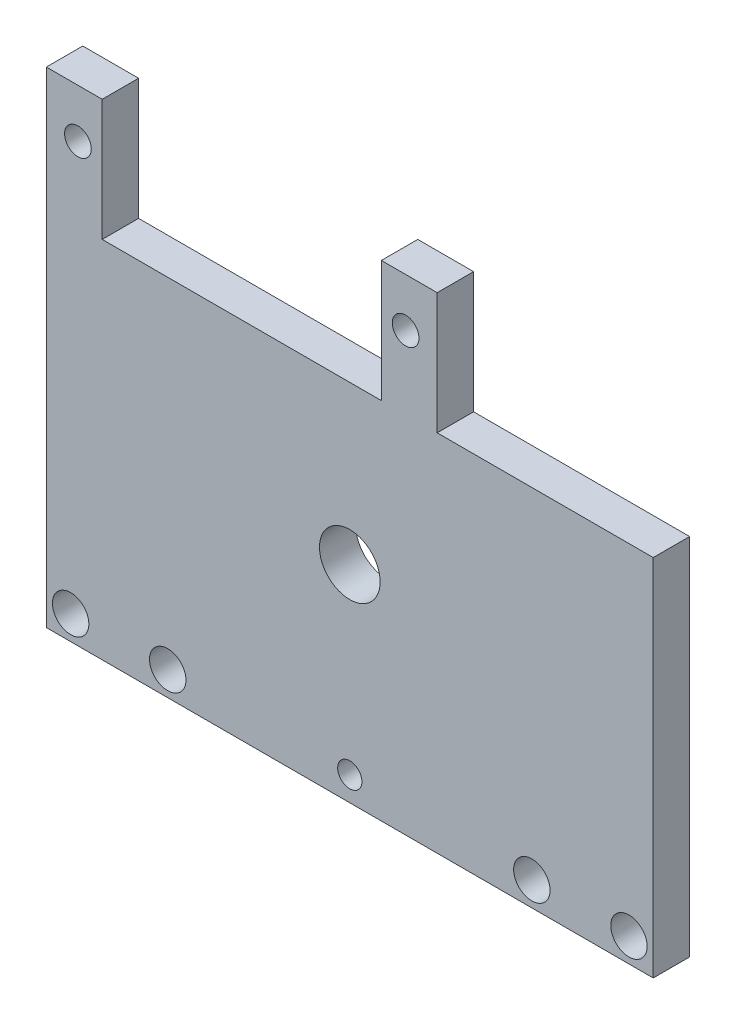
ISO-10303-21;
HEADER;
FILE_DESCRIPTION(('STEP AP214'),'2;1');
FILE_NAME('part.step','',(''),(''),'','','');
FILE_SCHEMA(('AUTOMOTIVE_DESIGN { 1 0 10303 214 1 1 1 1 }'));
ENDSEC;
DATA;
#1=APPLICATION_CONTEXT('core data for automotive mechanical design processes');
#2=APPLICATION_PROTOCOL_DEFINITION('international standard','automotive_design',2000,#1);
#3=PRODUCT_CONTEXT('',#1,'mechanical');
#4=PRODUCT('Part','Part','',(#3));
#5=PRODUCT_RELATED_PRODUCT_CATEGORY('part','',(#4));
#6=PRODUCT_DEFINITION_FORMATION('','',#4);
#7=PRODUCT_DEFINITION_CONTEXT('part definition',#1,'design');
#8=PRODUCT_DEFINITION('design','',#6,#7);
#9=PRODUCT_DEFINITION_SHAPE('','',#8);
#10=(LENGTH_UNIT() NAMED_UNIT(*) SI_UNIT(.MILLI.,.METRE.));
#11=(NAMED_UNIT(*) PLANE_ANGLE_UNIT() SI_UNIT($,.RADIAN.));
#12=(NAMED_UNIT(*) SI_UNIT($,.STERADIAN.) SOLID_ANGLE_UNIT());
#13=UNCERTAINTY_MEASURE_WITH_UNIT(LENGTH_MEASURE(1.E-05),#10,'distance_accuracy_value','');
#14=(GEOMETRIC_REPRESENTATION_CONTEXT(3) GLOBAL_UNCERTAINTY_ASSIGNED_CONTEXT((#13)) GLOBAL_UNIT_ASSIGNED_CONTEXT((#10,
#11,#12)) REPRESENTATION_CONTEXT('',''));
#15=CARTESIAN_POINT('',(0.,0.,0.));
#16=DIRECTION('',(0.,0.,1.));
#17=DIRECTION('',(1.,0.,0.));
#18=AXIS2_PLACEMENT_3D('',#15,#16,#17);
#19=CARTESIAN_POINT('',(0.,0.,3.));
#20=DIRECTION('',(0.,0.,1.));
#21=DIRECTION('',(1.,0.,0.));
#22=AXIS2_PLACEMENT_3D('',#19,#20,#21);
#23=PLANE('',#22);
#24=CARTESIAN_POINT('',(-27.410287043584,-20.6486779763174,3.));
#25=DIRECTION('',(0.,0.,1.));
#26=DIRECTION('',(1.,0.,0.));
#27=AXIS2_PLACEMENT_3D('',#24,#25,#26);
#28=CIRCLE('',#27,1.5);
#29=CARTESIAN_POINT('',(-25.910287043584,-20.6486779763174,3.));
#30=VERTEX_POINT('',#29);
#31=EDGE_CURVE('E242',#30,#30,#28,.T.);
#32=ORIENTED_EDGE('',*,*,#31,.F.);
#33=EDGE_LOOP('',(#32));
#34=FACE_BOUND('',#33,.T.);
#35=CARTESIAN_POINT('',(10.589712956416,-20.6486779763174,3.));
#36=DIRECTION('',(0.,0.,1.));
#37=DIRECTION('',(1.,0.,0.));
#38=AXIS2_PLACEMENT_3D('',#35,#36,#37);
#39=CIRCLE('',#38,1.5);
#40=CARTESIAN_POINT('',(12.089712956416,-20.6486779763174,3.));
#41=VERTEX_POINT('',#40);
#42=EDGE_CURVE('E230',#41,#41,#39,.T.);
#43=ORIENTED_EDGE('',*,*,#42,.F.);
#44=EDGE_LOOP('',(#43));
#45=FACE_BOUND('',#44,.T.);
#46=CARTESIAN_POINT('',(-7.81028704358401,13.3513220236826,3.));
#47=DIRECTION('',(0.,0.,1.));
#48=DIRECTION('',(1.,0.,0.));
#49=AXIS2_PLACEMENT_3D('',#46,#47,#48);
#50=CIRCLE('',#49,1.1);
#51=CARTESIAN_POINT('',(-6.710287043584,13.3513220236826,3.));
#52=VERTEX_POINT('',#51);
#53=EDGE_CURVE('E218',#52,#52,#50,.T.);
#54=ORIENTED_EDGE('',*,*,#53,.F.);
#55=EDGE_LOOP('',(#54));
#56=FACE_BOUND('',#55,.T.);
#57=CARTESIAN_POINT('',(-12.410287043584,-5.64867797631744,3.));
#58=DIRECTION('',(0.,0.,1.));
#59=DIRECTION('',(1.,0.,0.));
#60=AXIS2_PLACEMENT_3D('',#57,#58,#59);
#61=CIRCLE('',#60,2.5);
#62=CARTESIAN_POINT('',(-9.910287043584,-5.64867797631744,3.));
#63=VERTEX_POINT('',#62);
#64=EDGE_CURVE('E145',#63,#63,#61,.T.);
#65=ORIENTED_EDGE('',*,*,#64,.F.);
#66=EDGE_LOOP('',(#65));
#67=FACE_BOUND('',#66,.T.);
#68=DIRECTION('',(-1.,0.,0.));
#69=VECTOR('',#68,1.);
#70=CARTESIAN_POINT('',(-5.210287043584,7.35132202368256,3.));
#71=LINE('',#70,#69);
#72=CARTESIAN_POINT('',(12.589712956416,7.35132202368256,3.));
#73=VERTEX_POINT('',#72);
#74=CARTESIAN_POINT('',(-5.210287043584,7.35132202368256,3.));
#75=VERTEX_POINT('',#74);
#76=EDGE_CURVE('E161',#73,#75,#71,.T.);
#77=ORIENTED_EDGE('',*,*,#76,.T.);
#78=DIRECTION('',(0.,1.,0.));
#79=VECTOR('',#78,1.);
#80=CARTESIAN_POINT('',(-5.210287043584,7.35132202368256,3.));
#81=LINE('',#80,#79);
#82=CARTESIAN_POINT('',(-5.210287043584,17.3513220236826,3.));
#83=VERTEX_POINT('',#82);
#84=EDGE_CURVE('E99',#75,#83,#81,.T.);
#85=ORIENTED_EDGE('',*,*,#84,.T.);
#86=DIRECTION('',(-1.,0.,0.));
#87=VECTOR('',#86,1.);
#88=CARTESIAN_POINT('',(-9.810287043584,17.3513220236826,3.));
#89=LINE('',#88,#87);
#90=CARTESIAN_POINT('',(-9.810287043584,17.3513220236826,3.));
#91=VERTEX_POINT('',#90);
#92=EDGE_CURVE('E182',#83,#91,#89,.T.);
#93=ORIENTED_EDGE('',*,*,#92,.T.);
#94=DIRECTION('',(0.,-1.,0.));
#95=VECTOR('',#94,1.);
#96=CARTESIAN_POINT('',(-9.810287043584,7.35132202368256,3.));
#97=LINE('',#96,#95);
#98=CARTESIAN_POINT('',(-9.810287043584,7.35132202368256,3.));
#99=VERTEX_POINT('',#98);
#100=EDGE_CURVE('E201',#91,#99,#97,.T.);
#101=ORIENTED_EDGE('',*,*,#100,.T.);
#102=DIRECTION('',(-1.,0.,0.));
#103=VECTOR('',#102,1.);
#104=CARTESIAN_POINT('',(-32.810287043584,7.35132202368256,3.));
#105=LINE('',#104,#103);
#106=CARTESIAN_POINT('',(-32.810287043584,7.35132202368256,3.));
#107=VERTEX_POINT('',#106);
#108=EDGE_CURVE('E198',#99,#107,#105,.T.);
#109=ORIENTED_EDGE('',*,*,#108,.T.);
#110=DIRECTION('',(0.,1.,0.));
#111=VECTOR('',#110,1.);
#112=CARTESIAN_POINT('',(-32.810287043584,7.35132202368256,3.));
#113=LINE('',#112,#111);
#114=CARTESIAN_POINT('',(-32.810287043584,17.3513220236826,3.));
#115=VERTEX_POINT('',#114);
#116=EDGE_CURVE('E200',#107,#115,#113,.T.);
#117=ORIENTED_EDGE('',*,*,#116,.T.);
#118=DIRECTION('',(-1.,0.,0.));
#119=VECTOR('',#118,1.);
#120=CARTESIAN_POINT('',(-37.410287043584,17.3513220236826,3.));
#121=LINE('',#120,#119);
#122=CARTESIAN_POINT('',(-37.410287043584,17.3513220236826,3.));
#123=VERTEX_POINT('',#122);
#124=EDGE_CURVE('E124',#115,#123,#121,.T.);
#125=ORIENTED_EDGE('',*,*,#124,.T.);
#126=DIRECTION('',(0.,-1.,0.));
#127=VECTOR('',#126,1.);
#128=CARTESIAN_POINT('',(-37.410287043584,7.35132202368256,3.));
#129=LINE('',#128,#127);
#130=CARTESIAN_POINT('',(-37.410287043584,-22.6486779763174,3.));
#131=VERTEX_POINT('',#130);
#132=EDGE_CURVE('E118',#123,#131,#129,.T.);
#133=ORIENTED_EDGE('',*,*,#132,.T.);
#134=DIRECTION('',(1.,0.,0.));
#135=VECTOR('',#134,1.);
#136=CARTESIAN_POINT('',(-37.410287043584,-22.6486779763174,3.));
#137=LINE('',#136,#135);
#138=CARTESIAN_POINT('',(12.589712956416,-22.6486779763174,3.));
#139=VERTEX_POINT('',#138);
#140=EDGE_CURVE('E122',#131,#139,#137,.T.);
#141=ORIENTED_EDGE('',*,*,#140,.T.);
#142=DIRECTION('',(0.,1.,0.));
#143=VECTOR('',#142,1.);
#144=CARTESIAN_POINT('',(12.589712956416,-22.6486779763174,3.));
#145=LINE('',#144,#143);
#146=EDGE_CURVE('E50',#139,#73,#145,.T.);
#147=ORIENTED_EDGE('',*,*,#146,.T.);
#148=EDGE_LOOP('',(#77,#85,#93,#101,#109,#117,#125,#133,#141,#147));
#149=FACE_BOUND('',#148,.T.);
#150=CARTESIAN_POINT('',(-34.810287043584,13.3513220236826,3.));
#151=DIRECTION('',(0.,0.,1.));
#152=DIRECTION('',(1.,0.,0.));
#153=AXIS2_PLACEMENT_3D('',#150,#151,#152);
#154=CIRCLE('',#153,1.1);
#155=CARTESIAN_POINT('',(-33.710287043584,13.3513220236826,3.));
#156=VERTEX_POINT('',#155);
#157=EDGE_CURVE('E212',#156,#156,#154,.T.);
#158=ORIENTED_EDGE('',*,*,#157,.F.);
#159=EDGE_LOOP('',(#158));
#160=FACE_BOUND('',#159,.T.);
#161=CARTESIAN_POINT('',(-35.410287043584,-20.6486779763174,3.));
#162=DIRECTION('',(0.,0.,1.));
#163=DIRECTION('',(1.,0.,0.));
#164=AXIS2_PLACEMENT_3D('',#161,#162,#163);
#165=CIRCLE('',#164,1.5);
#166=CARTESIAN_POINT('',(-33.910287043584,-20.6486779763174,3.));
#167=VERTEX_POINT('',#166);
#168=EDGE_CURVE('E224',#167,#167,#165,.T.);
#169=ORIENTED_EDGE('',*,*,#168,.F.);
#170=EDGE_LOOP('',(#169));
#171=FACE_BOUND('',#170,.T.);
#172=CARTESIAN_POINT('',(-12.410287043584,-20.6486779763174,3.));
#173=DIRECTION('',(0.,0.,1.));
#174=DIRECTION('',(1.,0.,0.));
#175=AXIS2_PLACEMENT_3D('',#172,#173,#174);
#176=CIRCLE('',#175,1.);
#177=CARTESIAN_POINT('',(-11.410287043584,-20.6486779763174,3.));
#178=VERTEX_POINT('',#177);
#179=EDGE_CURVE('E236',#178,#178,#176,.T.);
#180=ORIENTED_EDGE('',*,*,#179,.F.);
#181=EDGE_LOOP('',(#180));
#182=FACE_BOUND('',#181,.T.);
#183=CARTESIAN_POINT('',(2.589712956416,-20.6486779763174,3.));
#184=DIRECTION('',(0.,0.,1.));
#185=DIRECTION('',(1.,0.,0.));
#186=AXIS2_PLACEMENT_3D('',#183,#184,#185);
#187=CIRCLE('',#186,1.5);
#188=CARTESIAN_POINT('',(4.089712956416,-20.6486779763174,3.));
#189=VERTEX_POINT('',#188);
#190=EDGE_CURVE('E248',#189,#189,#187,.T.);
#191=ORIENTED_EDGE('',*,*,#190,.F.);
#192=EDGE_LOOP('',(#191));
#193=FACE_BOUND('',#192,.T.);
#194=ADVANCED_FACE('F33',(#34,#45,#56,#67,#149,#160,#171,#182,#193),#23,.T.);
#195=CARTESIAN_POINT('',(0.,0.,0.));
#196=DIRECTION('',(0.,0.,1.));
#197=DIRECTION('',(1.,0.,0.));
#198=AXIS2_PLACEMENT_3D('',#195,#196,#197);
#199=PLANE('',#198);
#200=DIRECTION('',(-1.,0.,0.));
#201=VECTOR('',#200,1.);
#202=CARTESIAN_POINT('',(-5.210287043584,7.35132202368256,0.));
#203=LINE('',#202,#201);
#204=CARTESIAN_POINT('',(12.589712956416,7.35132202368256,0.));
#205=VERTEX_POINT('',#204);
#206=CARTESIAN_POINT('',(-5.210287043584,7.35132202368256,0.));
#207=VERTEX_POINT('',#206);
#208=EDGE_CURVE('E141',#205,#207,#203,.T.);
#209=ORIENTED_EDGE('',*,*,#208,.F.);
#210=DIRECTION('',(0.,1.,0.));
#211=VECTOR('',#210,1.);
#212=CARTESIAN_POINT('',(12.589712956416,-22.6486779763174,0.));
#213=LINE('',#212,#211);
#214=CARTESIAN_POINT('',(12.589712956416,-22.6486779763174,0.));
#215=VERTEX_POINT('',#214);
#216=EDGE_CURVE('E91',#215,#205,#213,.T.);
#217=ORIENTED_EDGE('',*,*,#216,.F.);
#218=DIRECTION('',(1.,0.,0.));
#219=VECTOR('',#218,1.);
#220=CARTESIAN_POINT('',(-37.410287043584,-22.6486779763174,0.));
#221=LINE('',#220,#219);
#222=CARTESIAN_POINT('',(-37.410287043584,-22.6486779763174,0.));
#223=VERTEX_POINT('',#222);
#224=EDGE_CURVE('E85',#223,#215,#221,.T.);
#225=ORIENTED_EDGE('',*,*,#224,.F.);
#226=DIRECTION('',(0.,-1.,0.));
#227=VECTOR('',#226,1.);
#228=CARTESIAN_POINT('',(-37.410287043584,-22.6486779763174,0.));
#229=LINE('',#228,#227);
#230=CARTESIAN_POINT('',(-37.410287043584,17.3513220236826,0.));
#231=VERTEX_POINT('',#230);
#232=EDGE_CURVE('E131',#231,#223,#229,.T.);
#233=ORIENTED_EDGE('',*,*,#232,.F.);
#234=DIRECTION('',(-1.,0.,0.));
#235=VECTOR('',#234,1.);
#236=CARTESIAN_POINT('',(-37.410287043584,17.3513220236826,0.));
#237=LINE('',#236,#235);
#238=CARTESIAN_POINT('',(-32.810287043584,17.3513220236826,0.));
#239=VERTEX_POINT('',#238);
#240=EDGE_CURVE('E155',#239,#231,#237,.T.);
#241=ORIENTED_EDGE('',*,*,#240,.F.);
#242=DIRECTION('',(0.,1.,0.));
#243=VECTOR('',#242,1.);
#244=CARTESIAN_POINT('',(-32.810287043584,7.35132202368256,0.));
#245=LINE('',#244,#243);
#246=CARTESIAN_POINT('',(-32.810287043584,7.35132202368256,0.));
#247=VERTEX_POINT('',#246);
#248=EDGE_CURVE('E153',#247,#239,#245,.T.);
#249=ORIENTED_EDGE('',*,*,#248,.F.);
#250=DIRECTION('',(-1.,0.,0.));
#251=VECTOR('',#250,1.);
#252=CARTESIAN_POINT('',(-32.810287043584,7.35132202368256,0.));
#253=LINE('',#252,#251);
#254=CARTESIAN_POINT('',(-9.810287043584,7.35132202368256,0.));
#255=VERTEX_POINT('',#254);
#256=EDGE_CURVE('E151',#255,#247,#253,.T.);
#257=ORIENTED_EDGE('',*,*,#256,.F.);
#258=DIRECTION('',(0.,-1.,0.));
#259=VECTOR('',#258,1.);
#260=CARTESIAN_POINT('',(-9.810287043584,7.35132202368256,0.));
#261=LINE('',#260,#259);
#262=CARTESIAN_POINT('',(-9.810287043584,17.3513220236826,0.));
#263=VERTEX_POINT('',#262);
#264=EDGE_CURVE('E149',#263,#255,#261,.T.);
#265=ORIENTED_EDGE('',*,*,#264,.F.);
#266=DIRECTION('',(-1.,0.,0.));
#267=VECTOR('',#266,1.);
#268=CARTESIAN_POINT('',(-9.810287043584,17.3513220236826,0.));
#269=LINE('',#268,#267);
#270=CARTESIAN_POINT('',(-5.210287043584,17.3513220236826,0.));
#271=VERTEX_POINT('',#270);
#272=EDGE_CURVE('E147',#271,#263,#269,.T.);
#273=ORIENTED_EDGE('',*,*,#272,.F.);
#274=DIRECTION('',(0.,1.,0.));
#275=VECTOR('',#274,1.);
#276=CARTESIAN_POINT('',(-5.210287043584,7.35132202368256,0.));
#277=LINE('',#276,#275);
#278=EDGE_CURVE('E144',#207,#271,#277,.T.);
#279=ORIENTED_EDGE('',*,*,#278,.F.);
#280=EDGE_LOOP('',(#209,#217,#225,#233,#241,#249,#257,#265,#273,#279));
#281=FACE_BOUND('',#280,.T.);
#282=CARTESIAN_POINT('',(-12.410287043584,-5.64867797631744,0.));
#283=DIRECTION('',(0.,0.,1.));
#284=DIRECTION('',(1.,0.,0.));
#285=AXIS2_PLACEMENT_3D('',#282,#283,#284);
#286=CIRCLE('',#285,2.5);
#287=CARTESIAN_POINT('',(-9.910287043584,-5.64867797631744,0.));
#288=VERTEX_POINT('',#287);
#289=EDGE_CURVE('E209',#288,#288,#286,.T.);
#290=ORIENTED_EDGE('',*,*,#289,.T.);
#291=EDGE_LOOP('',(#290));
#292=FACE_BOUND('',#291,.T.);
#293=CARTESIAN_POINT('',(-34.810287043584,13.3513220236826,0.));
#294=DIRECTION('',(0.,0.,1.));
#295=DIRECTION('',(1.,0.,0.));
#296=AXIS2_PLACEMENT_3D('',#293,#294,#295);
#297=CIRCLE('',#296,1.1);
#298=CARTESIAN_POINT('',(-33.710287043584,13.3513220236826,0.));
#299=VERTEX_POINT('',#298);
#300=EDGE_CURVE('E215',#299,#299,#297,.T.);
#301=ORIENTED_EDGE('',*,*,#300,.T.);
#302=EDGE_LOOP('',(#301));
#303=FACE_BOUND('',#302,.T.);
#304=CARTESIAN_POINT('',(-7.81028704358401,13.3513220236826,0.));
#305=DIRECTION('',(0.,0.,1.));
#306=DIRECTION('',(1.,0.,0.));
#307=AXIS2_PLACEMENT_3D('',#304,#305,#306);
#308=CIRCLE('',#307,1.1);
#309=CARTESIAN_POINT('',(-6.710287043584,13.3513220236826,0.));
#310=VERTEX_POINT('',#309);
#311=EDGE_CURVE('E221',#310,#310,#308,.T.);
#312=ORIENTED_EDGE('',*,*,#311,.T.);
#313=EDGE_LOOP('',(#312));
#314=FACE_BOUND('',#313,.T.);
#315=CARTESIAN_POINT('',(-35.410287043584,-20.6486779763174,0.));
#316=DIRECTION('',(0.,0.,1.));
#317=DIRECTION('',(1.,0.,0.));
#318=AXIS2_PLACEMENT_3D('',#315,#316,#317);
#319=CIRCLE('',#318,1.5);
#320=CARTESIAN_POINT('',(-33.910287043584,-20.6486779763174,0.));
#321=VERTEX_POINT('',#320);
#322=EDGE_CURVE('E227',#321,#321,#319,.T.);
#323=ORIENTED_EDGE('',*,*,#322,.T.);
#324=EDGE_LOOP('',(#323));
#325=FACE_BOUND('',#324,.T.);
#326=CARTESIAN_POINT('',(10.589712956416,-20.6486779763174,0.));
#327=DIRECTION('',(0.,0.,1.));
#328=DIRECTION('',(1.,0.,0.));
#329=AXIS2_PLACEMENT_3D('',#326,#327,#328);
#330=CIRCLE('',#329,1.5);
#331=CARTESIAN_POINT('',(12.089712956416,-20.6486779763174,0.));
#332=VERTEX_POINT('',#331);
#333=EDGE_CURVE('E233',#332,#332,#330,.T.);
#334=ORIENTED_EDGE('',*,*,#333,.T.);
#335=EDGE_LOOP('',(#334));
#336=FACE_BOUND('',#335,.T.);
#337=CARTESIAN_POINT('',(-12.410287043584,-20.6486779763174,0.));
#338=DIRECTION('',(0.,0.,1.));
#339=DIRECTION('',(1.,0.,0.));
#340=AXIS2_PLACEMENT_3D('',#337,#338,#339);
#341=CIRCLE('',#340,1.);
#342=CARTESIAN_POINT('',(-11.410287043584,-20.6486779763174,0.));
#343=VERTEX_POINT('',#342);
#344=EDGE_CURVE('E239',#343,#343,#341,.T.);
#345=ORIENTED_EDGE('',*,*,#344,.T.);
#346=EDGE_LOOP('',(#345));
#347=FACE_BOUND('',#346,.T.);
#348=CARTESIAN_POINT('',(-27.410287043584,-20.6486779763174,0.));
#349=DIRECTION('',(0.,0.,1.));
#350=DIRECTION('',(1.,0.,0.));
#351=AXIS2_PLACEMENT_3D('',#348,#349,#350);
#352=CIRCLE('',#351,1.5);
#353=CARTESIAN_POINT('',(-25.910287043584,-20.6486779763174,0.));
#354=VERTEX_POINT('',#353);
#355=EDGE_CURVE('E245',#354,#354,#352,.T.);
#356=ORIENTED_EDGE('',*,*,#355,.T.);
#357=EDGE_LOOP('',(#356));
#358=FACE_BOUND('',#357,.T.);
#359=CARTESIAN_POINT('',(2.589712956416,-20.6486779763174,0.));
#360=DIRECTION('',(0.,0.,1.));
#361=DIRECTION('',(1.,0.,0.));
#362=AXIS2_PLACEMENT_3D('',#359,#360,#361);
#363=CIRCLE('',#362,1.5);
#364=CARTESIAN_POINT('',(4.089712956416,-20.6486779763174,0.));
#365=VERTEX_POINT('',#364);
#366=EDGE_CURVE('E251',#365,#365,#363,.T.);
#367=ORIENTED_EDGE('',*,*,#366,.T.);
#368=EDGE_LOOP('',(#367));
#369=FACE_BOUND('',#368,.T.);
#370=ADVANCED_FACE('F186',(#281,#292,#303,#314,#325,#336,#347,#358,#369),#199,.F.);
#371=CARTESIAN_POINT('',(-5.210287043584,7.35132202368256,3.));
#372=DIRECTION('',(0.,-1.,0.));
#373=DIRECTION('',(0.,0.,-1.));
#374=AXIS2_PLACEMENT_3D('',#371,#372,#373);
#375=PLANE('',#374);
#376=ORIENTED_EDGE('',*,*,#208,.T.);
#377=DIRECTION('',(0.,0.,-1.));
#378=VECTOR('',#377,1.);
#379=CARTESIAN_POINT('',(-5.210287043584,7.35132202368256,3.));
#380=LINE('',#379,#378);
#381=EDGE_CURVE('E11',#75,#207,#380,.T.);
#382=ORIENTED_EDGE('',*,*,#381,.F.);
#383=ORIENTED_EDGE('',*,*,#76,.F.);
#384=DIRECTION('',(0.,0.,-1.));
#385=VECTOR('',#384,1.);
#386=CARTESIAN_POINT('',(12.589712956416,7.35132202368256,3.));
#387=LINE('',#386,#385);
#388=EDGE_CURVE('E137',#73,#205,#387,.T.);
#389=ORIENTED_EDGE('',*,*,#388,.T.);
#390=EDGE_LOOP('',(#376,#382,#383,#389));
#391=FACE_BOUND('',#390,.T.);
#392=ADVANCED_FACE('F35',(#391),#375,.F.);
#393=CARTESIAN_POINT('',(-5.210287043584,7.35132202368256,3.));
#394=DIRECTION('',(-1.,0.,0.));
#395=DIRECTION('',(0.,0.,1.));
#396=AXIS2_PLACEMENT_3D('',#393,#394,#395);
#397=PLANE('',#396);
#398=ORIENTED_EDGE('',*,*,#278,.T.);
#399=DIRECTION('',(0.,0.,-1.));
#400=VECTOR('',#399,1.);
#401=CARTESIAN_POINT('',(-5.210287043584,17.3513220236826,3.));
#402=LINE('',#401,#400);
#403=EDGE_CURVE('E42',#83,#271,#402,.T.);
#404=ORIENTED_EDGE('',*,*,#403,.F.);
#405=ORIENTED_EDGE('',*,*,#84,.F.);
#406=ORIENTED_EDGE('',*,*,#381,.T.);
#407=EDGE_LOOP('',(#398,#404,#405,#406));
#408=FACE_BOUND('',#407,.T.);
#409=ADVANCED_FACE('F293',(#408),#397,.F.);
#410=CARTESIAN_POINT('',(-9.810287043584,17.3513220236826,3.));
#411=DIRECTION('',(0.,-1.,0.));
#412=DIRECTION('',(0.,0.,-1.));
#413=AXIS2_PLACEMENT_3D('',#410,#411,#412);
#414=PLANE('',#413);
#415=ORIENTED_EDGE('',*,*,#272,.T.);
#416=DIRECTION('',(0.,0.,-1.));
#417=VECTOR('',#416,1.);
#418=CARTESIAN_POINT('',(-9.810287043584,17.3513220236826,3.));
#419=LINE('',#418,#417);
#420=EDGE_CURVE('E174',#91,#263,#419,.T.);
#421=ORIENTED_EDGE('',*,*,#420,.F.);
#422=ORIENTED_EDGE('',*,*,#92,.F.);
#423=ORIENTED_EDGE('',*,*,#403,.T.);
#424=EDGE_LOOP('',(#415,#421,#422,#423));
#425=FACE_BOUND('',#424,.T.);
#426=ADVANCED_FACE('F180',(#425),#414,.F.);
#427=CARTESIAN_POINT('',(-9.810287043584,7.35132202368256,3.));
#428=DIRECTION('',(1.,0.,0.));
#429=DIRECTION('',(0.,0.,-1.));
#430=AXIS2_PLACEMENT_3D('',#427,#428,#429);
#431=PLANE('',#430);
#432=ORIENTED_EDGE('',*,*,#264,.T.);
#433=DIRECTION('',(0.,0.,-1.));
#434=VECTOR('',#433,1.);
#435=CARTESIAN_POINT('',(-9.810287043584,7.35132202368256,3.));
#436=LINE('',#435,#434);
#437=EDGE_CURVE('E171',#99,#255,#436,.T.);
#438=ORIENTED_EDGE('',*,*,#437,.F.);
#439=ORIENTED_EDGE('',*,*,#100,.F.);
#440=ORIENTED_EDGE('',*,*,#420,.T.);
#441=EDGE_LOOP('',(#432,#438,#439,#440));
#442=FACE_BOUND('',#441,.T.);
#443=ADVANCED_FACE('F192',(#442),#431,.F.);
#444=CARTESIAN_POINT('',(-32.810287043584,7.35132202368256,3.));
#445=DIRECTION('',(0.,-1.,0.));
#446=DIRECTION('',(0.,0.,-1.));
#447=AXIS2_PLACEMENT_3D('',#444,#445,#446);
#448=PLANE('',#447);
#449=ORIENTED_EDGE('',*,*,#256,.T.);
#450=DIRECTION('',(0.,0.,-1.));
#451=VECTOR('',#450,1.);
#452=CARTESIAN_POINT('',(-32.810287043584,7.35132202368256,3.));
#453=LINE('',#452,#451);
#454=EDGE_CURVE('E168',#107,#247,#453,.T.);
#455=ORIENTED_EDGE('',*,*,#454,.F.);
#456=ORIENTED_EDGE('',*,*,#108,.F.);
#457=ORIENTED_EDGE('',*,*,#437,.T.);
#458=EDGE_LOOP('',(#449,#455,#456,#457));
#459=FACE_BOUND('',#458,.T.);
#460=ADVANCED_FACE('F196',(#459),#448,.F.);
#461=CARTESIAN_POINT('',(-32.810287043584,7.35132202368256,3.));
#462=DIRECTION('',(-1.,0.,0.));
#463=DIRECTION('',(0.,0.,1.));
#464=AXIS2_PLACEMENT_3D('',#461,#462,#463);
#465=PLANE('',#464);
#466=ORIENTED_EDGE('',*,*,#248,.T.);
#467=DIRECTION('',(0.,0.,-1.));
#468=VECTOR('',#467,1.);
#469=CARTESIAN_POINT('',(-32.810287043584,17.3513220236826,3.));
#470=LINE('',#469,#468);
#471=EDGE_CURVE('E165',#115,#239,#470,.T.);
#472=ORIENTED_EDGE('',*,*,#471,.F.);
#473=ORIENTED_EDGE('',*,*,#116,.F.);
#474=ORIENTED_EDGE('',*,*,#454,.T.);
#475=EDGE_LOOP('',(#466,#472,#473,#474));
#476=FACE_BOUND('',#475,.T.);
#477=ADVANCED_FACE('F283',(#476),#465,.F.);
#478=CARTESIAN_POINT('',(-37.410287043584,17.3513220236826,3.));
#479=DIRECTION('',(0.,-1.,0.));
#480=DIRECTION('',(0.,0.,-1.));
#481=AXIS2_PLACEMENT_3D('',#478,#479,#480);
#482=PLANE('',#481);
#483=ORIENTED_EDGE('',*,*,#240,.T.);
#484=DIRECTION('',(0.,0.,-1.));
#485=VECTOR('',#484,1.);
#486=CARTESIAN_POINT('',(-37.410287043584,17.3513220236826,3.));
#487=LINE('',#486,#485);
#488=EDGE_CURVE('E132',#123,#231,#487,.T.);
#489=ORIENTED_EDGE('',*,*,#488,.F.);
#490=ORIENTED_EDGE('',*,*,#124,.F.);
#491=ORIENTED_EDGE('',*,*,#471,.T.);
#492=EDGE_LOOP('',(#483,#489,#490,#491));
#493=FACE_BOUND('',#492,.T.);
#494=ADVANCED_FACE('F280',(#493),#482,.F.);
#495=CARTESIAN_POINT('',(-37.410287043584,-22.6486779763174,3.));
#496=DIRECTION('',(1.,0.,0.));
#497=DIRECTION('',(0.,0.,-1.));
#498=AXIS2_PLACEMENT_3D('',#495,#496,#497);
#499=PLANE('',#498);
#500=ORIENTED_EDGE('',*,*,#232,.T.);
#501=DIRECTION('',(0.,0.,-1.));
#502=VECTOR('',#501,1.);
#503=CARTESIAN_POINT('',(-37.410287043584,-22.6486779763174,3.));
#504=LINE('',#503,#502);
#505=EDGE_CURVE('E129',#131,#223,#504,.T.);
#506=ORIENTED_EDGE('',*,*,#505,.F.);
#507=ORIENTED_EDGE('',*,*,#132,.F.);
#508=ORIENTED_EDGE('',*,*,#488,.T.);
#509=EDGE_LOOP('',(#500,#506,#507,#508));
#510=FACE_BOUND('',#509,.T.);
#511=ADVANCED_FACE('F130',(#510),#499,.F.);
#512=CARTESIAN_POINT('',(-37.410287043584,-22.6486779763174,3.));
#513=DIRECTION('',(0.,1.,0.));
#514=DIRECTION('',(0.,0.,1.));
#515=AXIS2_PLACEMENT_3D('',#512,#513,#514);
#516=PLANE('',#515);
#517=ORIENTED_EDGE('',*,*,#224,.T.);
#518=DIRECTION('',(0.,0.,-1.));
#519=VECTOR('',#518,1.);
#520=CARTESIAN_POINT('',(12.589712956416,-22.6486779763174,3.));
#521=LINE('',#520,#519);
#522=EDGE_CURVE('E133',#139,#215,#521,.T.);
#523=ORIENTED_EDGE('',*,*,#522,.F.);
#524=ORIENTED_EDGE('',*,*,#140,.F.);
#525=ORIENTED_EDGE('',*,*,#505,.T.);
#526=EDGE_LOOP('',(#517,#523,#524,#525));
#527=FACE_BOUND('',#526,.T.);
#528=ADVANCED_FACE('F135',(#527),#516,.F.);
#529=CARTESIAN_POINT('',(12.589712956416,-22.6486779763174,3.));
#530=DIRECTION('',(-1.,0.,0.));
#531=DIRECTION('',(0.,0.,1.));
#532=AXIS2_PLACEMENT_3D('',#529,#530,#531);
#533=PLANE('',#532);
#534=ORIENTED_EDGE('',*,*,#216,.T.);
#535=ORIENTED_EDGE('',*,*,#388,.F.);
#536=ORIENTED_EDGE('',*,*,#146,.F.);
#537=ORIENTED_EDGE('',*,*,#522,.T.);
#538=EDGE_LOOP('',(#534,#535,#536,#537));
#539=FACE_BOUND('',#538,.T.);
#540=ADVANCED_FACE('F273',(#539),#533,.F.);
#541=CARTESIAN_POINT('',(-12.410287043584,-5.64867797631744,3.));
#542=DIRECTION('',(0.,0.,-1.));
#543=DIRECTION('',(-1.,0.,0.));
#544=AXIS2_PLACEMENT_3D('',#541,#542,#543);
#545=CYLINDRICAL_SURFACE('',#544,2.5);
#546=ORIENTED_EDGE('',*,*,#64,.T.);
#547=EDGE_LOOP('',(#546));
#548=FACE_BOUND('',#547,.T.);
#549=ORIENTED_EDGE('',*,*,#289,.F.);
#550=EDGE_LOOP('',(#549));
#551=FACE_BOUND('',#550,.T.);
#552=ADVANCED_FACE('F270',(#548,#551),#545,.F.);
#553=CARTESIAN_POINT('',(-34.810287043584,13.3513220236826,3.));
#554=DIRECTION('',(0.,0.,-1.));
#555=DIRECTION('',(-1.,0.,0.));
#556=AXIS2_PLACEMENT_3D('',#553,#554,#555);
#557=CYLINDRICAL_SURFACE('',#556,1.1);
#558=ORIENTED_EDGE('',*,*,#157,.T.);
#559=EDGE_LOOP('',(#558));
#560=FACE_BOUND('',#559,.T.);
#561=ORIENTED_EDGE('',*,*,#300,.F.);
#562=EDGE_LOOP('',(#561));
#563=FACE_BOUND('',#562,.T.);
#564=ADVANCED_FACE('F372',(#560,#563),#557,.F.);
#565=CARTESIAN_POINT('',(-7.81028704358401,13.3513220236826,3.));
#566=DIRECTION('',(0.,0.,-1.));
#567=DIRECTION('',(-1.,0.,0.));
#568=AXIS2_PLACEMENT_3D('',#565,#566,#567);
#569=CYLINDRICAL_SURFACE('',#568,1.1);
#570=ORIENTED_EDGE('',*,*,#53,.T.);
#571=EDGE_LOOP('',(#570));
#572=FACE_BOUND('',#571,.T.);
#573=ORIENTED_EDGE('',*,*,#311,.F.);
#574=EDGE_LOOP('',(#573));
#575=FACE_BOUND('',#574,.T.);
#576=ADVANCED_FACE('F380',(#572,#575),#569,.F.);
#577=CARTESIAN_POINT('',(-35.410287043584,-20.6486779763174,3.));
#578=DIRECTION('',(0.,0.,-1.));
#579=DIRECTION('',(-1.,0.,0.));
#580=AXIS2_PLACEMENT_3D('',#577,#578,#579);
#581=CYLINDRICAL_SURFACE('',#580,1.5);
#582=ORIENTED_EDGE('',*,*,#168,.T.);
#583=EDGE_LOOP('',(#582));
#584=FACE_BOUND('',#583,.T.);
#585=ORIENTED_EDGE('',*,*,#322,.F.);
#586=EDGE_LOOP('',(#585));
#587=FACE_BOUND('',#586,.T.);
#588=ADVANCED_FACE('F388',(#584,#587),#581,.F.);
#589=CARTESIAN_POINT('',(10.589712956416,-20.6486779763174,3.));
#590=DIRECTION('',(0.,0.,-1.));
#591=DIRECTION('',(-1.,0.,0.));
#592=AXIS2_PLACEMENT_3D('',#589,#590,#591);
#593=CYLINDRICAL_SURFACE('',#592,1.5);
#594=ORIENTED_EDGE('',*,*,#42,.T.);
#595=EDGE_LOOP('',(#594));
#596=FACE_BOUND('',#595,.T.);
#597=ORIENTED_EDGE('',*,*,#333,.F.);
#598=EDGE_LOOP('',(#597));
#599=FACE_BOUND('',#598,.T.);
#600=ADVANCED_FACE('F397',(#596,#599),#593,.F.);
#601=CARTESIAN_POINT('',(-12.410287043584,-20.6486779763174,3.));
#602=DIRECTION('',(0.,0.,-1.));
#603=DIRECTION('',(-1.,0.,0.));
#604=AXIS2_PLACEMENT_3D('',#601,#602,#603);
#605=CYLINDRICAL_SURFACE('',#604,1.);
#606=ORIENTED_EDGE('',*,*,#179,.T.);
#607=EDGE_LOOP('',(#606));
#608=FACE_BOUND('',#607,.T.);
#609=ORIENTED_EDGE('',*,*,#344,.F.);
#610=EDGE_LOOP('',(#609));
#611=FACE_BOUND('',#610,.T.);
#612=ADVANCED_FACE('F406',(#608,#611),#605,.F.);
#613=CARTESIAN_POINT('',(-27.410287043584,-20.6486779763174,3.));
#614=DIRECTION('',(0.,0.,-1.));
#615=DIRECTION('',(-1.,0.,0.));
#616=AXIS2_PLACEMENT_3D('',#613,#614,#615);
#617=CYLINDRICAL_SURFACE('',#616,1.5);
#618=ORIENTED_EDGE('',*,*,#31,.T.);
#619=EDGE_LOOP('',(#618));
#620=FACE_BOUND('',#619,.T.);
#621=ORIENTED_EDGE('',*,*,#355,.F.);
#622=EDGE_LOOP('',(#621));
#623=FACE_BOUND('',#622,.T.);
#624=ADVANCED_FACE('F415',(#620,#623),#617,.F.);
#625=CARTESIAN_POINT('',(2.589712956416,-20.6486779763174,3.));
#626=DIRECTION('',(0.,0.,-1.));
#627=DIRECTION('',(-1.,0.,0.));
#628=AXIS2_PLACEMENT_3D('',#625,#626,#627);
#629=CYLINDRICAL_SURFACE('',#628,1.5);
#630=ORIENTED_EDGE('',*,*,#190,.T.);
#631=EDGE_LOOP('',(#630));
#632=FACE_BOUND('',#631,.T.);
#633=ORIENTED_EDGE('',*,*,#366,.F.);
#634=EDGE_LOOP('',(#633));
#635=FACE_BOUND('',#634,.T.);
#636=ADVANCED_FACE('F257',(#632,#635),#629,.F.);
#637=CLOSED_SHELL('',(#194,#370,#392,#409,#426,#443,#460,#477,#494,#511,#528,#540,#552,#564,
#576,#588,#600,#612,#624,#636));
#638=MANIFOLD_SOLID_BREP('B2',#637);
#639=ADVANCED_BREP_SHAPE_REPRESENTATION('',(#18,#638),#14);
#640=SHAPE_DEFINITION_REPRESENTATION(#9,#639);
ENDSEC;
END-ISO-10303-21;
